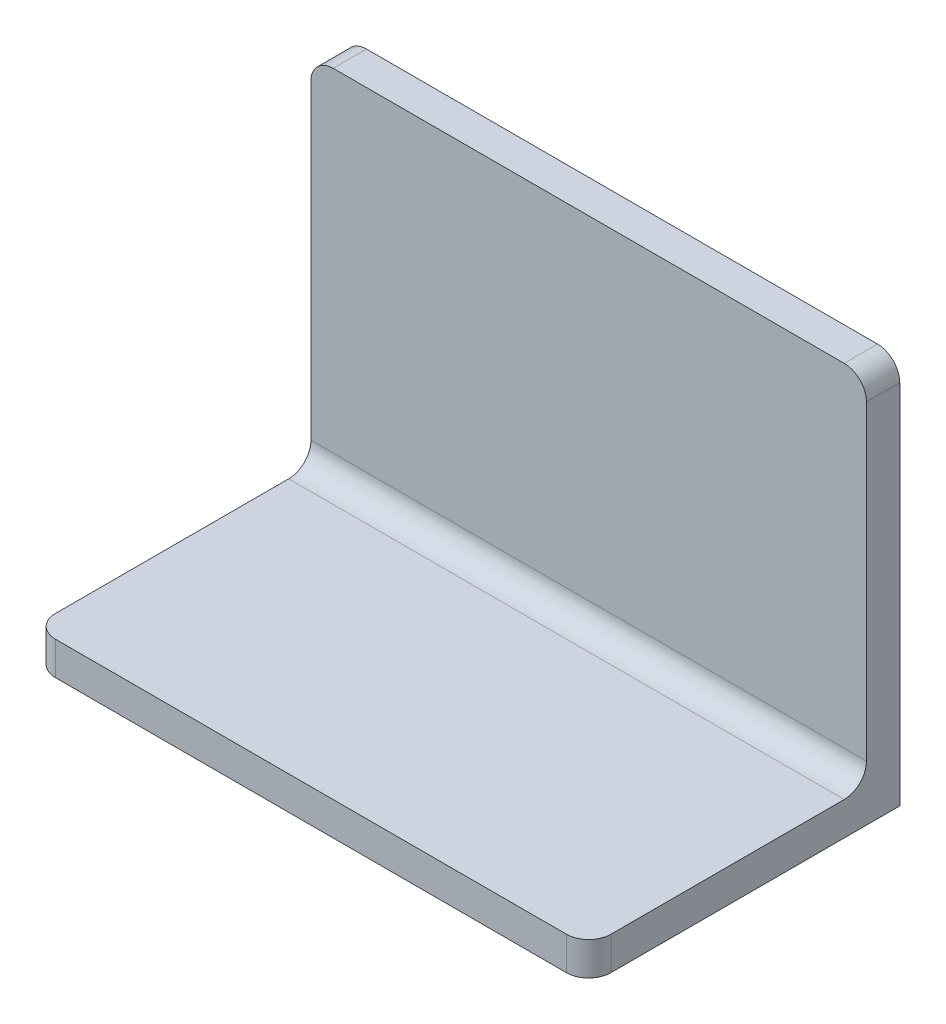
ISO-10303-21;
HEADER;
FILE_DESCRIPTION(('STEP AP214'),'2;1');
FILE_NAME('part.step','',(''),(''),'','','');
FILE_SCHEMA(('AUTOMOTIVE_DESIGN { 1 0 10303 214 1 1 1 1 }'));
ENDSEC;
DATA;
#1=APPLICATION_CONTEXT('core data for automotive mechanical design processes');
#2=APPLICATION_PROTOCOL_DEFINITION('international standard','automotive_design',2000,#1);
#3=PRODUCT_CONTEXT('',#1,'mechanical');
#4=PRODUCT('Part','Part','',(#3));
#5=PRODUCT_RELATED_PRODUCT_CATEGORY('part','',(#4));
#6=PRODUCT_DEFINITION_FORMATION('','',#4);
#7=PRODUCT_DEFINITION_CONTEXT('part definition',#1,'design');
#8=PRODUCT_DEFINITION('design','',#6,#7);
#9=PRODUCT_DEFINITION_SHAPE('','',#8);
#10=(LENGTH_UNIT() NAMED_UNIT(*) SI_UNIT(.MILLI.,.METRE.));
#11=(NAMED_UNIT(*) PLANE_ANGLE_UNIT() SI_UNIT($,.RADIAN.));
#12=(NAMED_UNIT(*) SI_UNIT($,.STERADIAN.) SOLID_ANGLE_UNIT());
#13=UNCERTAINTY_MEASURE_WITH_UNIT(LENGTH_MEASURE(1.E-05),#10,'distance_accuracy_value','');
#14=(GEOMETRIC_REPRESENTATION_CONTEXT(3) GLOBAL_UNCERTAINTY_ASSIGNED_CONTEXT((#13)) GLOBAL_UNIT_ASSIGNED_CONTEXT((#10,
#11,#12)) REPRESENTATION_CONTEXT('',''));
#15=CARTESIAN_POINT('',(0.,0.,0.));
#16=DIRECTION('',(0.,0.,1.));
#17=DIRECTION('',(1.,0.,0.));
#18=AXIS2_PLACEMENT_3D('',#15,#16,#17);
#19=CARTESIAN_POINT('',(0.,0.,3.));
#20=DIRECTION('',(0.,0.,-1.));
#21=DIRECTION('',(-1.,0.,0.));
#22=AXIS2_PLACEMENT_3D('',#19,#20,#21);
#23=PLANE('',#22);
#24=DIRECTION('',(-1.,0.,0.));
#25=VECTOR('',#24,1.);
#26=CARTESIAN_POINT('',(-25.,17.5,3.));
#27=LINE('',#26,#25);
#28=CARTESIAN_POINT('',(23.,17.5,3.));
#29=VERTEX_POINT('',#28);
#30=CARTESIAN_POINT('',(-23.,17.5,3.));
#31=VERTEX_POINT('',#30);
#32=EDGE_CURVE('E158',#29,#31,#27,.T.);
#33=ORIENTED_EDGE('',*,*,#32,.T.);
#34=CARTESIAN_POINT('',(-23.,15.5,3.));
#35=DIRECTION('',(0.,0.,-1.));
#36=DIRECTION('',(-1.,0.,0.));
#37=AXIS2_PLACEMENT_3D('',#34,#35,#36);
#38=CIRCLE('',#37,2.);
#39=CARTESIAN_POINT('',(-25.,15.5,3.));
#40=VERTEX_POINT('',#39);
#41=EDGE_CURVE('E200',#31,#40,#38,.F.);
#42=ORIENTED_EDGE('',*,*,#41,.T.);
#43=DIRECTION('',(0.,-1.,0.));
#44=VECTOR('',#43,1.);
#45=CARTESIAN_POINT('',(-25.,-17.5,3.));
#46=LINE('',#45,#44);
#47=CARTESIAN_POINT('',(-25.,-12.5,3.));
#48=VERTEX_POINT('',#47);
#49=EDGE_CURVE('E163',#40,#48,#46,.T.);
#50=ORIENTED_EDGE('',*,*,#49,.T.);
#51=DIRECTION('',(-1.,0.,0.));
#52=VECTOR('',#51,1.);
#53=CARTESIAN_POINT('',(25.,-12.5,3.));
#54=LINE('',#53,#52);
#55=CARTESIAN_POINT('',(25.,-12.5,3.));
#56=VERTEX_POINT('',#55);
#57=EDGE_CURVE('E168',#48,#56,#54,.F.);
#58=ORIENTED_EDGE('',*,*,#57,.T.);
#59=DIRECTION('',(0.,1.,0.));
#60=VECTOR('',#59,1.);
#61=CARTESIAN_POINT('',(25.,-17.5,3.));
#62=LINE('',#61,#60);
#63=CARTESIAN_POINT('',(25.,15.5,3.));
#64=VERTEX_POINT('',#63);
#65=EDGE_CURVE('E154',#56,#64,#62,.T.);
#66=ORIENTED_EDGE('',*,*,#65,.T.);
#67=CARTESIAN_POINT('',(23.,15.5,3.));
#68=DIRECTION('',(0.,0.,-1.));
#69=DIRECTION('',(-1.,0.,0.));
#70=AXIS2_PLACEMENT_3D('',#67,#68,#69);
#71=CIRCLE('',#70,2.);
#72=EDGE_CURVE('E197',#64,#29,#71,.F.);
#73=ORIENTED_EDGE('',*,*,#72,.T.);
#74=EDGE_LOOP('',(#33,#42,#50,#58,#66,#73));
#75=FACE_BOUND('',#74,.T.);
#76=ADVANCED_FACE('F39',(#75),#23,.F.);
#77=CARTESIAN_POINT('',(25.,-17.5,3.));
#78=DIRECTION('',(-1.,0.,0.));
#79=DIRECTION('',(0.,0.,1.));
#80=AXIS2_PLACEMENT_3D('',#77,#78,#79);
#81=PLANE('',#80);
#82=DIRECTION('',(0.,1.,0.));
#83=VECTOR('',#82,1.);
#84=CARTESIAN_POINT('',(25.,-17.5,0.));
#85=LINE('',#84,#83);
#86=CARTESIAN_POINT('',(25.,-17.5,0.));
#87=VERTEX_POINT('',#86);
#88=CARTESIAN_POINT('',(25.,15.5,0.));
#89=VERTEX_POINT('',#88);
#90=EDGE_CURVE('E152',#87,#89,#85,.T.);
#91=ORIENTED_EDGE('',*,*,#90,.T.);
#92=DIRECTION('',(0.,0.,-1.));
#93=VECTOR('',#92,1.);
#94=CARTESIAN_POINT('',(25.,15.5,3.));
#95=LINE('',#94,#93);
#96=EDGE_CURVE('E206',#89,#64,#95,.F.);
#97=ORIENTED_EDGE('',*,*,#96,.T.);
#98=ORIENTED_EDGE('',*,*,#65,.F.);
#99=CARTESIAN_POINT('',(25.,-12.5,5.));
#100=DIRECTION('',(-1.,0.,0.));
#101=DIRECTION('',(0.,0.,1.));
#102=AXIS2_PLACEMENT_3D('',#99,#100,#101);
#103=CIRCLE('',#102,2.);
#104=CARTESIAN_POINT('',(25.,-14.5,5.));
#105=VERTEX_POINT('',#104);
#106=EDGE_CURVE('E175',#56,#105,#103,.T.);
#107=ORIENTED_EDGE('',*,*,#106,.T.);
#108=DIRECTION('',(0.,0.,-1.));
#109=VECTOR('',#108,1.);
#110=CARTESIAN_POINT('',(25.,-14.5,28.));
#111=LINE('',#110,#109);
#112=CARTESIAN_POINT('',(25.,-14.5,26.));
#113=VERTEX_POINT('',#112);
#114=EDGE_CURVE('E231',#113,#105,#111,.T.);
#115=ORIENTED_EDGE('',*,*,#114,.F.);
#116=DIRECTION('',(0.,1.,0.));
#117=VECTOR('',#116,1.);
#118=CARTESIAN_POINT('',(25.,-17.5,26.));
#119=LINE('',#118,#117);
#120=CARTESIAN_POINT('',(25.,-17.5,26.));
#121=VERTEX_POINT('',#120);
#122=EDGE_CURVE('E203',#113,#121,#119,.F.);
#123=ORIENTED_EDGE('',*,*,#122,.T.);
#124=DIRECTION('',(0.,0.,-1.));
#125=VECTOR('',#124,1.);
#126=CARTESIAN_POINT('',(25.,-17.5,3.));
#127=LINE('',#126,#125);
#128=EDGE_CURVE('E137',#121,#87,#127,.T.);
#129=ORIENTED_EDGE('',*,*,#128,.T.);
#130=EDGE_LOOP('',(#91,#97,#98,#107,#115,#123,#129));
#131=FACE_BOUND('',#130,.T.);
#132=ADVANCED_FACE('F251',(#131),#81,.F.);
#133=CARTESIAN_POINT('',(-25.,17.5,3.));
#134=DIRECTION('',(0.,-1.,0.));
#135=DIRECTION('',(0.,0.,-1.));
#136=AXIS2_PLACEMENT_3D('',#133,#134,#135);
#137=PLANE('',#136);
#138=DIRECTION('',(-1.,0.,0.));
#139=VECTOR('',#138,1.);
#140=CARTESIAN_POINT('',(-25.,17.5,0.));
#141=LINE('',#140,#139);
#142=CARTESIAN_POINT('',(23.,17.5,0.));
#143=VERTEX_POINT('',#142);
#144=CARTESIAN_POINT('',(-23.,17.5,0.));
#145=VERTEX_POINT('',#144);
#146=EDGE_CURVE('E148',#143,#145,#141,.T.);
#147=ORIENTED_EDGE('',*,*,#146,.T.);
#148=DIRECTION('',(0.,0.,-1.));
#149=VECTOR('',#148,1.);
#150=CARTESIAN_POINT('',(-23.,17.5,3.));
#151=LINE('',#150,#149);
#152=EDGE_CURVE('E194',#145,#31,#151,.F.);
#153=ORIENTED_EDGE('',*,*,#152,.T.);
#154=ORIENTED_EDGE('',*,*,#32,.F.);
#155=DIRECTION('',(0.,0.,-1.));
#156=VECTOR('',#155,1.);
#157=CARTESIAN_POINT('',(23.,17.5,3.));
#158=LINE('',#157,#156);
#159=EDGE_CURVE('E190',#29,#143,#158,.T.);
#160=ORIENTED_EDGE('',*,*,#159,.T.);
#161=EDGE_LOOP('',(#147,#153,#154,#160));
#162=FACE_BOUND('',#161,.T.);
#163=ADVANCED_FACE('F237',(#162),#137,.F.);
#164=CARTESIAN_POINT('',(-25.,-17.5,3.));
#165=DIRECTION('',(1.,0.,0.));
#166=DIRECTION('',(0.,0.,-1.));
#167=AXIS2_PLACEMENT_3D('',#164,#165,#166);
#168=PLANE('',#167);
#169=ORIENTED_EDGE('',*,*,#49,.F.);
#170=DIRECTION('',(0.,0.,-1.));
#171=VECTOR('',#170,1.);
#172=CARTESIAN_POINT('',(-25.,15.5,3.));
#173=LINE('',#172,#171);
#174=CARTESIAN_POINT('',(-25.,15.5,0.));
#175=VERTEX_POINT('',#174);
#176=EDGE_CURVE('E145',#40,#175,#173,.T.);
#177=ORIENTED_EDGE('',*,*,#176,.T.);
#178=DIRECTION('',(0.,-1.,0.));
#179=VECTOR('',#178,1.);
#180=CARTESIAN_POINT('',(-25.,-17.5,0.));
#181=LINE('',#180,#179);
#182=CARTESIAN_POINT('',(-25.,-17.5,0.));
#183=VERTEX_POINT('',#182);
#184=EDGE_CURVE('E141',#175,#183,#181,.T.);
#185=ORIENTED_EDGE('',*,*,#184,.T.);
#186=DIRECTION('',(0.,0.,-1.));
#187=VECTOR('',#186,1.);
#188=CARTESIAN_POINT('',(-25.,-17.5,3.));
#189=LINE('',#188,#187);
#190=CARTESIAN_POINT('',(-25.,-17.5,26.));
#191=VERTEX_POINT('',#190);
#192=EDGE_CURVE('E125',#191,#183,#189,.T.);
#193=ORIENTED_EDGE('',*,*,#192,.F.);
#194=DIRECTION('',(0.,-1.,0.));
#195=VECTOR('',#194,1.);
#196=CARTESIAN_POINT('',(-25.,-17.5,26.));
#197=LINE('',#196,#195);
#198=CARTESIAN_POINT('',(-25.,-14.5,26.));
#199=VERTEX_POINT('',#198);
#200=EDGE_CURVE('E179',#191,#199,#197,.F.);
#201=ORIENTED_EDGE('',*,*,#200,.T.);
#202=DIRECTION('',(0.,0.,-1.));
#203=VECTOR('',#202,1.);
#204=CARTESIAN_POINT('',(-25.,-14.5,28.));
#205=LINE('',#204,#203);
#206=CARTESIAN_POINT('',(-25.,-14.5,5.));
#207=VERTEX_POINT('',#206);
#208=EDGE_CURVE('E243',#199,#207,#205,.T.);
#209=ORIENTED_EDGE('',*,*,#208,.T.);
#210=CARTESIAN_POINT('',(-25.,-12.5,5.));
#211=DIRECTION('',(1.,0.,0.));
#212=DIRECTION('',(0.,0.,-1.));
#213=AXIS2_PLACEMENT_3D('',#210,#211,#212);
#214=CIRCLE('',#213,2.);
#215=EDGE_CURVE('E171',#207,#48,#214,.T.);
#216=ORIENTED_EDGE('',*,*,#215,.T.);
#217=EDGE_LOOP('',(#169,#177,#185,#193,#201,#209,#216));
#218=FACE_BOUND('',#217,.T.);
#219=ADVANCED_FACE('F143',(#218),#168,.F.);
#220=CARTESIAN_POINT('',(-25.,-17.5,3.));
#221=DIRECTION('',(0.,1.,0.));
#222=DIRECTION('',(0.,0.,1.));
#223=AXIS2_PLACEMENT_3D('',#220,#221,#222);
#224=PLANE('',#223);
#225=ORIENTED_EDGE('',*,*,#128,.F.);
#226=CARTESIAN_POINT('',(23.,-17.5,26.));
#227=DIRECTION('',(0.,1.,0.));
#228=DIRECTION('',(0.,0.,1.));
#229=AXIS2_PLACEMENT_3D('',#226,#227,#228);
#230=CIRCLE('',#229,2.);
#231=CARTESIAN_POINT('',(23.,-17.5,28.));
#232=VERTEX_POINT('',#231);
#233=EDGE_CURVE('E11',#121,#232,#230,.F.);
#234=ORIENTED_EDGE('',*,*,#233,.T.);
#235=DIRECTION('',(1.,0.,0.));
#236=VECTOR('',#235,1.);
#237=CARTESIAN_POINT('',(-25.,-17.5,28.));
#238=LINE('',#237,#236);
#239=CARTESIAN_POINT('',(-23.,-17.5,28.));
#240=VERTEX_POINT('',#239);
#241=EDGE_CURVE('E292',#240,#232,#238,.T.);
#242=ORIENTED_EDGE('',*,*,#241,.F.);
#243=CARTESIAN_POINT('',(-23.,-17.5,26.));
#244=DIRECTION('',(0.,1.,0.));
#245=DIRECTION('',(0.,0.,1.));
#246=AXIS2_PLACEMENT_3D('',#243,#244,#245);
#247=CIRCLE('',#246,2.);
#248=EDGE_CURVE('E48',#240,#191,#247,.F.);
#249=ORIENTED_EDGE('',*,*,#248,.T.);
#250=ORIENTED_EDGE('',*,*,#192,.T.);
#251=DIRECTION('',(1.,0.,0.));
#252=VECTOR('',#251,1.);
#253=CARTESIAN_POINT('',(-25.,-17.5,0.));
#254=LINE('',#253,#252);
#255=EDGE_CURVE('E130',#183,#87,#254,.T.);
#256=ORIENTED_EDGE('',*,*,#255,.T.);
#257=EDGE_LOOP('',(#225,#234,#242,#249,#250,#256));
#258=FACE_BOUND('',#257,.T.);
#259=ADVANCED_FACE('F128',(#258),#224,.F.);
#260=CARTESIAN_POINT('',(0.,0.,0.));
#261=DIRECTION('',(0.,0.,-1.));
#262=DIRECTION('',(-1.,0.,0.));
#263=AXIS2_PLACEMENT_3D('',#260,#261,#262);
#264=PLANE('',#263);
#265=ORIENTED_EDGE('',*,*,#184,.F.);
#266=CARTESIAN_POINT('',(-23.,15.5,0.));
#267=DIRECTION('',(0.,0.,-1.));
#268=DIRECTION('',(-1.,0.,0.));
#269=AXIS2_PLACEMENT_3D('',#266,#267,#268);
#270=CIRCLE('',#269,2.);
#271=EDGE_CURVE('E187',#175,#145,#270,.T.);
#272=ORIENTED_EDGE('',*,*,#271,.T.);
#273=ORIENTED_EDGE('',*,*,#146,.F.);
#274=CARTESIAN_POINT('',(23.,15.5,0.));
#275=DIRECTION('',(0.,0.,-1.));
#276=DIRECTION('',(-1.,0.,0.));
#277=AXIS2_PLACEMENT_3D('',#274,#275,#276);
#278=CIRCLE('',#277,2.);
#279=EDGE_CURVE('E184',#143,#89,#278,.T.);
#280=ORIENTED_EDGE('',*,*,#279,.T.);
#281=ORIENTED_EDGE('',*,*,#90,.F.);
#282=ORIENTED_EDGE('',*,*,#255,.F.);
#283=EDGE_LOOP('',(#265,#272,#273,#280,#281,#282));
#284=FACE_BOUND('',#283,.T.);
#285=ADVANCED_FACE('F150',(#284),#264,.T.);
#286=CARTESIAN_POINT('',(-25.,-14.5,28.));
#287=DIRECTION('',(0.,-1.,0.));
#288=DIRECTION('',(0.,0.,-1.));
#289=AXIS2_PLACEMENT_3D('',#286,#287,#288);
#290=PLANE('',#289);
#291=DIRECTION('',(-1.,0.,0.));
#292=VECTOR('',#291,1.);
#293=CARTESIAN_POINT('',(-25.,-14.5,28.));
#294=LINE('',#293,#292);
#295=CARTESIAN_POINT('',(23.,-14.5,28.));
#296=VERTEX_POINT('',#295);
#297=CARTESIAN_POINT('',(-23.,-14.5,28.));
#298=VERTEX_POINT('',#297);
#299=EDGE_CURVE('E295',#296,#298,#294,.T.);
#300=ORIENTED_EDGE('',*,*,#299,.F.);
#301=CARTESIAN_POINT('',(23.,-14.5,26.));
#302=DIRECTION('',(0.,-1.,0.));
#303=DIRECTION('',(0.,0.,-1.));
#304=AXIS2_PLACEMENT_3D('',#301,#302,#303);
#305=CIRCLE('',#304,2.);
#306=EDGE_CURVE('E63',#296,#113,#305,.F.);
#307=ORIENTED_EDGE('',*,*,#306,.T.);
#308=ORIENTED_EDGE('',*,*,#114,.T.);
#309=DIRECTION('',(-1.,0.,0.));
#310=VECTOR('',#309,1.);
#311=CARTESIAN_POINT('',(-25.,-14.5,5.));
#312=LINE('',#311,#310);
#313=EDGE_CURVE('E136',#105,#207,#312,.T.);
#314=ORIENTED_EDGE('',*,*,#313,.T.);
#315=ORIENTED_EDGE('',*,*,#208,.F.);
#316=CARTESIAN_POINT('',(-23.,-14.5,26.));
#317=DIRECTION('',(0.,-1.,0.));
#318=DIRECTION('',(0.,0.,-1.));
#319=AXIS2_PLACEMENT_3D('',#316,#317,#318);
#320=CIRCLE('',#319,2.);
#321=EDGE_CURVE('E55',#199,#298,#320,.F.);
#322=ORIENTED_EDGE('',*,*,#321,.T.);
#323=EDGE_LOOP('',(#300,#307,#308,#314,#315,#322));
#324=FACE_BOUND('',#323,.T.);
#325=ADVANCED_FACE('F272',(#324),#290,.F.);
#326=CARTESIAN_POINT('',(0.,0.,28.));
#327=DIRECTION('',(0.,0.,-1.));
#328=DIRECTION('',(-1.,0.,0.));
#329=AXIS2_PLACEMENT_3D('',#326,#327,#328);
#330=PLANE('',#329);
#331=ORIENTED_EDGE('',*,*,#241,.T.);
#332=DIRECTION('',(0.,1.,0.));
#333=VECTOR('',#332,1.);
#334=CARTESIAN_POINT('',(23.,0.,28.));
#335=LINE('',#334,#333);
#336=EDGE_CURVE('E213',#232,#296,#335,.T.);
#337=ORIENTED_EDGE('',*,*,#336,.T.);
#338=ORIENTED_EDGE('',*,*,#299,.T.);
#339=DIRECTION('',(0.,-1.,0.));
#340=VECTOR('',#339,1.);
#341=CARTESIAN_POINT('',(-23.,0.,28.));
#342=LINE('',#341,#340);
#343=EDGE_CURVE('E209',#298,#240,#342,.T.);
#344=ORIENTED_EDGE('',*,*,#343,.T.);
#345=EDGE_LOOP('',(#331,#337,#338,#344));
#346=FACE_BOUND('',#345,.T.);
#347=ADVANCED_FACE('F283',(#346),#330,.F.);
#348=CARTESIAN_POINT('',(-25.,-12.5,5.));
#349=DIRECTION('',(1.,0.,0.));
#350=DIRECTION('',(0.,0.,-1.));
#351=AXIS2_PLACEMENT_3D('',#348,#349,#350);
#352=CYLINDRICAL_SURFACE('',#351,2.);
#353=ORIENTED_EDGE('',*,*,#106,.F.);
#354=ORIENTED_EDGE('',*,*,#57,.F.);
#355=ORIENTED_EDGE('',*,*,#215,.F.);
#356=ORIENTED_EDGE('',*,*,#313,.F.);
#357=EDGE_LOOP('',(#353,#354,#355,#356));
#358=FACE_BOUND('',#357,.T.);
#359=ADVANCED_FACE('F247',(#358),#352,.F.);
#360=CARTESIAN_POINT('',(-23.,15.5,3.));
#361=DIRECTION('',(0.,0.,-1.));
#362=DIRECTION('',(-1.,0.,0.));
#363=AXIS2_PLACEMENT_3D('',#360,#361,#362);
#364=CYLINDRICAL_SURFACE('',#363,2.);
#365=ORIENTED_EDGE('',*,*,#41,.F.);
#366=ORIENTED_EDGE('',*,*,#152,.F.);
#367=ORIENTED_EDGE('',*,*,#271,.F.);
#368=ORIENTED_EDGE('',*,*,#176,.F.);
#369=EDGE_LOOP('',(#365,#366,#367,#368));
#370=FACE_BOUND('',#369,.T.);
#371=ADVANCED_FACE('F240',(#370),#364,.T.);
#372=CARTESIAN_POINT('',(23.,15.5,3.));
#373=DIRECTION('',(0.,0.,-1.));
#374=DIRECTION('',(-1.,0.,0.));
#375=AXIS2_PLACEMENT_3D('',#372,#373,#374);
#376=CYLINDRICAL_SURFACE('',#375,2.);
#377=ORIENTED_EDGE('',*,*,#72,.F.);
#378=ORIENTED_EDGE('',*,*,#96,.F.);
#379=ORIENTED_EDGE('',*,*,#279,.F.);
#380=ORIENTED_EDGE('',*,*,#159,.F.);
#381=EDGE_LOOP('',(#377,#378,#379,#380));
#382=FACE_BOUND('',#381,.T.);
#383=ADVANCED_FACE('F255',(#382),#376,.T.);
#384=CARTESIAN_POINT('',(23.,0.,26.));
#385=DIRECTION('',(0.,1.,0.));
#386=DIRECTION('',(0.,0.,1.));
#387=AXIS2_PLACEMENT_3D('',#384,#385,#386);
#388=CYLINDRICAL_SURFACE('',#387,2.);
#389=ORIENTED_EDGE('',*,*,#233,.F.);
#390=ORIENTED_EDGE('',*,*,#122,.F.);
#391=ORIENTED_EDGE('',*,*,#306,.F.);
#392=ORIENTED_EDGE('',*,*,#336,.F.);
#393=EDGE_LOOP('',(#389,#390,#391,#392));
#394=FACE_BOUND('',#393,.T.);
#395=ADVANCED_FACE('F257',(#394),#388,.T.);
#396=CARTESIAN_POINT('',(-23.,0.,26.));
#397=DIRECTION('',(0.,-1.,0.));
#398=DIRECTION('',(0.,0.,-1.));
#399=AXIS2_PLACEMENT_3D('',#396,#397,#398);
#400=CYLINDRICAL_SURFACE('',#399,2.);
#401=ORIENTED_EDGE('',*,*,#321,.F.);
#402=ORIENTED_EDGE('',*,*,#200,.F.);
#403=ORIENTED_EDGE('',*,*,#248,.F.);
#404=ORIENTED_EDGE('',*,*,#343,.F.);
#405=EDGE_LOOP('',(#401,#402,#403,#404));
#406=FACE_BOUND('',#405,.T.);
#407=ADVANCED_FACE('F41',(#406),#400,.T.);
#408=CLOSED_SHELL('',(#76,#132,#163,#219,#259,#285,#325,#347,#359,#371,#383,#395,#407));
#409=MANIFOLD_SOLID_BREP('B2',#408);
#410=ADVANCED_BREP_SHAPE_REPRESENTATION('',(#18,#409),#14);
#411=SHAPE_DEFINITION_REPRESENTATION(#9,#410);
ENDSEC;
END-ISO-10303-21;
